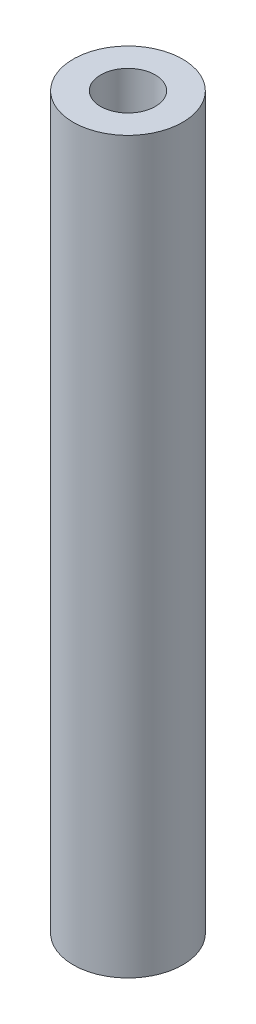
ISO-10303-21;
HEADER;
FILE_DESCRIPTION(('STEP AP214'),'2;1');
FILE_NAME('part.step','',(''),(''),'','','');
FILE_SCHEMA(('AUTOMOTIVE_DESIGN { 1 0 10303 214 1 1 1 1 }'));
ENDSEC;
DATA;
#1=APPLICATION_CONTEXT('core data for automotive mechanical design processes');
#2=APPLICATION_PROTOCOL_DEFINITION('international standard','automotive_design',2000,#1);
#3=PRODUCT_CONTEXT('',#1,'mechanical');
#4=PRODUCT('Part','Part','',(#3));
#5=PRODUCT_RELATED_PRODUCT_CATEGORY('part','',(#4));
#6=PRODUCT_DEFINITION_FORMATION('','',#4);
#7=PRODUCT_DEFINITION_CONTEXT('part definition',#1,'design');
#8=PRODUCT_DEFINITION('design','',#6,#7);
#9=PRODUCT_DEFINITION_SHAPE('','',#8);
#10=(LENGTH_UNIT() NAMED_UNIT(*) SI_UNIT(.MILLI.,.METRE.));
#11=(NAMED_UNIT(*) PLANE_ANGLE_UNIT() SI_UNIT($,.RADIAN.));
#12=(NAMED_UNIT(*) SI_UNIT($,.STERADIAN.) SOLID_ANGLE_UNIT());
#13=UNCERTAINTY_MEASURE_WITH_UNIT(LENGTH_MEASURE(1.E-05),#10,'distance_accuracy_value','');
#14=(GEOMETRIC_REPRESENTATION_CONTEXT(3) GLOBAL_UNCERTAINTY_ASSIGNED_CONTEXT((#13)) GLOBAL_UNIT_ASSIGNED_CONTEXT((#10,
#11,#12)) REPRESENTATION_CONTEXT('',''));
#15=CARTESIAN_POINT('',(0.,0.,0.));
#16=DIRECTION('',(0.,0.,1.));
#17=DIRECTION('',(1.,0.,0.));
#18=AXIS2_PLACEMENT_3D('',#15,#16,#17);
#19=CARTESIAN_POINT('',(0.,40.,0.));
#20=DIRECTION('',(0.,1.,0.));
#21=DIRECTION('',(0.,0.,1.));
#22=AXIS2_PLACEMENT_3D('',#19,#20,#21);
#23=PLANE('',#22);
#24=CARTESIAN_POINT('',(0.,40.,0.));
#25=DIRECTION('',(0.,1.,0.));
#26=DIRECTION('',(0.,0.,1.));
#27=AXIS2_PLACEMENT_3D('',#24,#25,#26);
#28=CIRCLE('',#27,3.);
#29=CARTESIAN_POINT('',(0.,40.,3.));
#30=VERTEX_POINT('',#29);
#31=EDGE_CURVE('E10',#30,#30,#28,.T.);
#32=ORIENTED_EDGE('',*,*,#31,.T.);
#33=EDGE_LOOP('',(#32));
#34=FACE_BOUND('',#33,.T.);
#35=CARTESIAN_POINT('',(0.,40.,0.));
#36=DIRECTION('',(0.,1.,0.));
#37=DIRECTION('',(0.,0.,1.));
#38=AXIS2_PLACEMENT_3D('',#35,#36,#37);
#39=CIRCLE('',#38,1.5);
#40=CARTESIAN_POINT('',(0.,40.,1.5));
#41=VERTEX_POINT('',#40);
#42=EDGE_CURVE('E42',#41,#41,#39,.T.);
#43=ORIENTED_EDGE('',*,*,#42,.F.);
#44=EDGE_LOOP('',(#43));
#45=FACE_BOUND('',#44,.T.);
#46=ADVANCED_FACE('F31',(#34,#45),#23,.T.);
#47=CARTESIAN_POINT('',(0.,0.,0.));
#48=DIRECTION('',(0.,1.,0.));
#49=DIRECTION('',(0.,0.,1.));
#50=AXIS2_PLACEMENT_3D('',#47,#48,#49);
#51=PLANE('',#50);
#52=CARTESIAN_POINT('',(0.,0.,0.));
#53=DIRECTION('',(0.,1.,0.));
#54=DIRECTION('',(0.,0.,1.));
#55=AXIS2_PLACEMENT_3D('',#52,#53,#54);
#56=CIRCLE('',#55,3.);
#57=CARTESIAN_POINT('',(0.,0.,3.));
#58=VERTEX_POINT('',#57);
#59=EDGE_CURVE('E35',#58,#58,#56,.T.);
#60=ORIENTED_EDGE('',*,*,#59,.F.);
#61=EDGE_LOOP('',(#60));
#62=FACE_BOUND('',#61,.T.);
#63=CARTESIAN_POINT('',(0.,0.,0.));
#64=DIRECTION('',(0.,1.,0.));
#65=DIRECTION('',(0.,0.,1.));
#66=AXIS2_PLACEMENT_3D('',#63,#64,#65);
#67=CIRCLE('',#66,1.5);
#68=CARTESIAN_POINT('',(0.,0.,1.5));
#69=VERTEX_POINT('',#68);
#70=EDGE_CURVE('E44',#69,#69,#67,.T.);
#71=ORIENTED_EDGE('',*,*,#70,.T.);
#72=EDGE_LOOP('',(#71));
#73=FACE_BOUND('',#72,.T.);
#74=ADVANCED_FACE('F54',(#62,#73),#51,.F.);
#75=CARTESIAN_POINT('',(0.,40.,0.));
#76=DIRECTION('',(0.,-1.,0.));
#77=DIRECTION('',(0.,0.,-1.));
#78=AXIS2_PLACEMENT_3D('',#75,#76,#77);
#79=CYLINDRICAL_SURFACE('',#78,3.);
#80=ORIENTED_EDGE('',*,*,#31,.F.);
#81=EDGE_LOOP('',(#80));
#82=FACE_BOUND('',#81,.T.);
#83=ORIENTED_EDGE('',*,*,#59,.T.);
#84=EDGE_LOOP('',(#83));
#85=FACE_BOUND('',#84,.T.);
#86=ADVANCED_FACE('F33',(#82,#85),#79,.T.);
#87=CARTESIAN_POINT('',(0.,40.,0.));
#88=DIRECTION('',(0.,-1.,0.));
#89=DIRECTION('',(0.,0.,-1.));
#90=AXIS2_PLACEMENT_3D('',#87,#88,#89);
#91=CYLINDRICAL_SURFACE('',#90,1.5);
#92=ORIENTED_EDGE('',*,*,#42,.T.);
#93=EDGE_LOOP('',(#92));
#94=FACE_BOUND('',#93,.T.);
#95=ORIENTED_EDGE('',*,*,#70,.F.);
#96=EDGE_LOOP('',(#95));
#97=FACE_BOUND('',#96,.T.);
#98=ADVANCED_FACE('F50',(#94,#97),#91,.F.);
#99=CLOSED_SHELL('',(#46,#74,#86,#98));
#100=MANIFOLD_SOLID_BREP('B2',#99);
#101=ADVANCED_BREP_SHAPE_REPRESENTATION('',(#18,#100),#14);
#102=SHAPE_DEFINITION_REPRESENTATION(#9,#101);
ENDSEC;
END-ISO-10303-21;
